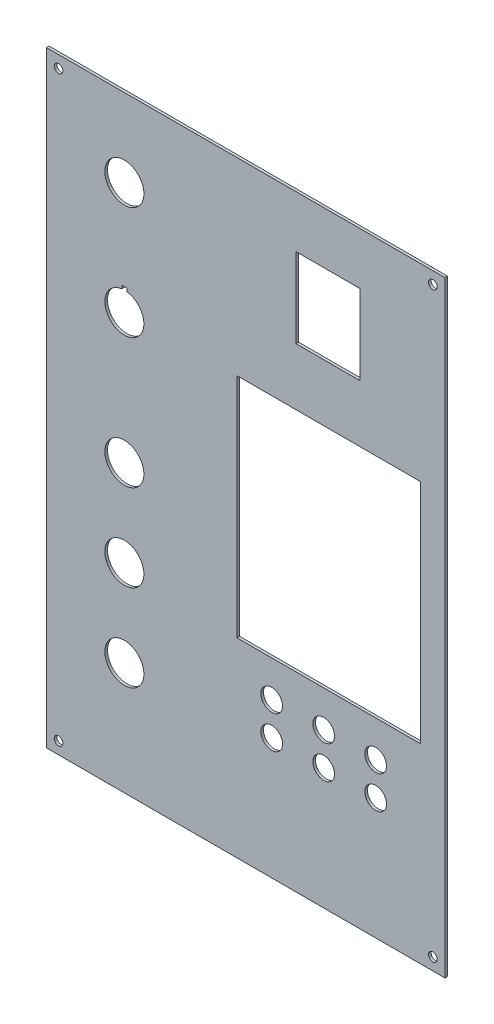
ISO-10303-21;
HEADER;
FILE_DESCRIPTION(('STEP AP214'),'2;1');
FILE_NAME('part.step','',(''),(''),'','','');
FILE_SCHEMA(('AUTOMOTIVE_DESIGN { 1 0 10303 214 1 1 1 1 }'));
ENDSEC;
DATA;
#1=APPLICATION_CONTEXT('core data for automotive mechanical design processes');
#2=APPLICATION_PROTOCOL_DEFINITION('international standard','automotive_design',2000,#1);
#3=PRODUCT_CONTEXT('',#1,'mechanical');
#4=PRODUCT('Part','Part','',(#3));
#5=PRODUCT_RELATED_PRODUCT_CATEGORY('part','',(#4));
#6=PRODUCT_DEFINITION_FORMATION('','',#4);
#7=PRODUCT_DEFINITION_CONTEXT('part definition',#1,'design');
#8=PRODUCT_DEFINITION('design','',#6,#7);
#9=PRODUCT_DEFINITION_SHAPE('','',#8);
#10=(LENGTH_UNIT() NAMED_UNIT(*) SI_UNIT(.MILLI.,.METRE.));
#11=(NAMED_UNIT(*) PLANE_ANGLE_UNIT() SI_UNIT($,.RADIAN.));
#12=(NAMED_UNIT(*) SI_UNIT($,.STERADIAN.) SOLID_ANGLE_UNIT());
#13=UNCERTAINTY_MEASURE_WITH_UNIT(LENGTH_MEASURE(1.E-05),#10,'distance_accuracy_value','');
#14=(GEOMETRIC_REPRESENTATION_CONTEXT(3) GLOBAL_UNCERTAINTY_ASSIGNED_CONTEXT((#13)) GLOBAL_UNIT_ASSIGNED_CONTEXT((#10,
#11,#12)) REPRESENTATION_CONTEXT('',''));
#15=CARTESIAN_POINT('',(0.,0.,0.));
#16=DIRECTION('',(0.,0.,1.));
#17=DIRECTION('',(1.,0.,0.));
#18=AXIS2_PLACEMENT_3D('',#15,#16,#17);
#19=CARTESIAN_POINT('',(0.,0.,1.5));
#20=DIRECTION('',(1.,0.,0.));
#21=DIRECTION('',(0.,0.,-1.));
#22=AXIS2_PLACEMENT_3D('',#19,#20,#21);
#23=PLANE('',#22);
#24=DIRECTION('',(0.,-1.,0.));
#25=VECTOR('',#24,1.);
#26=CARTESIAN_POINT('',(0.,0.,0.));
#27=LINE('',#26,#25);
#28=CARTESIAN_POINT('',(0.,350.,0.));
#29=VERTEX_POINT('',#28);
#30=CARTESIAN_POINT('',(0.,0.,0.));
#31=VERTEX_POINT('',#30);
#32=EDGE_CURVE('E329',#29,#31,#27,.T.);
#33=ORIENTED_EDGE('',*,*,#32,.T.);
#34=DIRECTION('',(0.,0.,-1.));
#35=VECTOR('',#34,1.);
#36=CARTESIAN_POINT('',(0.,0.,1.5));
#37=LINE('',#36,#35);
#38=CARTESIAN_POINT('',(0.,0.,1.5));
#39=VERTEX_POINT('',#38);
#40=EDGE_CURVE('E11',#39,#31,#37,.T.);
#41=ORIENTED_EDGE('',*,*,#40,.F.);
#42=DIRECTION('',(0.,-1.,0.));
#43=VECTOR('',#42,1.);
#44=CARTESIAN_POINT('',(0.,0.,1.5));
#45=LINE('',#44,#43);
#46=CARTESIAN_POINT('',(0.,350.,1.5));
#47=VERTEX_POINT('',#46);
#48=EDGE_CURVE('E338',#47,#39,#45,.T.);
#49=ORIENTED_EDGE('',*,*,#48,.F.);
#50=DIRECTION('',(0.,0.,-1.));
#51=VECTOR('',#50,1.);
#52=CARTESIAN_POINT('',(0.,350.,1.5));
#53=LINE('',#52,#51);
#54=EDGE_CURVE('E347',#47,#29,#53,.T.);
#55=ORIENTED_EDGE('',*,*,#54,.T.);
#56=EDGE_LOOP('',(#33,#41,#49,#55));
#57=FACE_BOUND('',#56,.T.);
#58=ADVANCED_FACE('F33',(#57),#23,.F.);
#59=CARTESIAN_POINT('',(0.,0.,1.5));
#60=DIRECTION('',(0.,1.,0.));
#61=DIRECTION('',(0.,0.,1.));
#62=AXIS2_PLACEMENT_3D('',#59,#60,#61);
#63=PLANE('',#62);
#64=DIRECTION('',(1.,0.,0.));
#65=VECTOR('',#64,1.);
#66=CARTESIAN_POINT('',(0.,0.,0.));
#67=LINE('',#66,#65);
#68=CARTESIAN_POINT('',(230.,0.,0.));
#69=VERTEX_POINT('',#68);
#70=EDGE_CURVE('E332',#31,#69,#67,.T.);
#71=ORIENTED_EDGE('',*,*,#70,.T.);
#72=DIRECTION('',(0.,0.,-1.));
#73=VECTOR('',#72,1.);
#74=CARTESIAN_POINT('',(230.,0.,1.5));
#75=LINE('',#74,#73);
#76=CARTESIAN_POINT('',(230.,0.,1.5));
#77=VERTEX_POINT('',#76);
#78=EDGE_CURVE('E40',#77,#69,#75,.T.);
#79=ORIENTED_EDGE('',*,*,#78,.F.);
#80=DIRECTION('',(1.,0.,0.));
#81=VECTOR('',#80,1.);
#82=CARTESIAN_POINT('',(0.,0.,1.5));
#83=LINE('',#82,#81);
#84=EDGE_CURVE('E341',#39,#77,#83,.T.);
#85=ORIENTED_EDGE('',*,*,#84,.F.);
#86=ORIENTED_EDGE('',*,*,#40,.T.);
#87=EDGE_LOOP('',(#71,#79,#85,#86));
#88=FACE_BOUND('',#87,.T.);
#89=ADVANCED_FACE('F372',(#88),#63,.F.);
#90=CARTESIAN_POINT('',(230.,0.,1.5));
#91=DIRECTION('',(-1.,0.,0.));
#92=DIRECTION('',(0.,0.,1.));
#93=AXIS2_PLACEMENT_3D('',#90,#91,#92);
#94=PLANE('',#93);
#95=DIRECTION('',(0.,1.,0.));
#96=VECTOR('',#95,1.);
#97=CARTESIAN_POINT('',(230.,0.,0.));
#98=LINE('',#97,#96);
#99=CARTESIAN_POINT('',(230.,350.,0.));
#100=VERTEX_POINT('',#99);
#101=EDGE_CURVE('E334',#69,#100,#98,.T.);
#102=ORIENTED_EDGE('',*,*,#101,.T.);
#103=DIRECTION('',(0.,0.,-1.));
#104=VECTOR('',#103,1.);
#105=CARTESIAN_POINT('',(230.,350.,1.5));
#106=LINE('',#105,#104);
#107=CARTESIAN_POINT('',(230.,350.,1.5));
#108=VERTEX_POINT('',#107);
#109=EDGE_CURVE('E350',#108,#100,#106,.T.);
#110=ORIENTED_EDGE('',*,*,#109,.F.);
#111=DIRECTION('',(0.,1.,0.));
#112=VECTOR('',#111,1.);
#113=CARTESIAN_POINT('',(230.,0.,1.5));
#114=LINE('',#113,#112);
#115=EDGE_CURVE('E343',#77,#108,#114,.T.);
#116=ORIENTED_EDGE('',*,*,#115,.F.);
#117=ORIENTED_EDGE('',*,*,#78,.T.);
#118=EDGE_LOOP('',(#102,#110,#116,#117));
#119=FACE_BOUND('',#118,.T.);
#120=ADVANCED_FACE('F357',(#119),#94,.F.);
#121=CARTESIAN_POINT('',(0.,350.,1.5));
#122=DIRECTION('',(0.,-1.,0.));
#123=DIRECTION('',(0.,0.,-1.));
#124=AXIS2_PLACEMENT_3D('',#121,#122,#123);
#125=PLANE('',#124);
#126=DIRECTION('',(-1.,0.,0.));
#127=VECTOR('',#126,1.);
#128=CARTESIAN_POINT('',(0.,350.,0.));
#129=LINE('',#128,#127);
#130=EDGE_CURVE('E336',#100,#29,#129,.T.);
#131=ORIENTED_EDGE('',*,*,#130,.T.);
#132=ORIENTED_EDGE('',*,*,#54,.F.);
#133=DIRECTION('',(-1.,0.,0.));
#134=VECTOR('',#133,1.);
#135=CARTESIAN_POINT('',(0.,350.,1.5));
#136=LINE('',#135,#134);
#137=EDGE_CURVE('E345',#108,#47,#136,.T.);
#138=ORIENTED_EDGE('',*,*,#137,.F.);
#139=ORIENTED_EDGE('',*,*,#109,.T.);
#140=EDGE_LOOP('',(#131,#132,#138,#139));
#141=FACE_BOUND('',#140,.T.);
#142=ADVANCED_FACE('F366',(#141),#125,.F.);
#143=CARTESIAN_POINT('',(0.,350.,1.5));
#144=DIRECTION('',(0.,0.,-1.));
#145=DIRECTION('',(-1.,0.,0.));
#146=AXIS2_PLACEMENT_3D('',#143,#144,#145);
#147=PLANE('',#146);
#148=DIRECTION('',(1.,0.,0.));
#149=VECTOR('',#148,1.);
#150=CARTESIAN_POINT('',(144.,274.,1.5));
#151=LINE('',#150,#149);
#152=CARTESIAN_POINT('',(144.,274.,1.5));
#153=VERTEX_POINT('',#152);
#154=CARTESIAN_POINT('',(181.,274.,1.5));
#155=VERTEX_POINT('',#154);
#156=EDGE_CURVE('E156',#153,#155,#151,.T.);
#157=ORIENTED_EDGE('',*,*,#156,.F.);
#158=DIRECTION('',(0.,-1.,0.));
#159=VECTOR('',#158,1.);
#160=CARTESIAN_POINT('',(144.,320.,1.5));
#161=LINE('',#160,#159);
#162=CARTESIAN_POINT('',(144.,320.,1.5));
#163=VERTEX_POINT('',#162);
#164=EDGE_CURVE('E47',#163,#153,#161,.T.);
#165=ORIENTED_EDGE('',*,*,#164,.F.);
#166=DIRECTION('',(-1.,0.,0.));
#167=VECTOR('',#166,1.);
#168=CARTESIAN_POINT('',(144.,320.,1.5));
#169=LINE('',#168,#167);
#170=CARTESIAN_POINT('',(181.,320.,1.5));
#171=VERTEX_POINT('',#170);
#172=EDGE_CURVE('E163',#171,#163,#169,.T.);
#173=ORIENTED_EDGE('',*,*,#172,.F.);
#174=DIRECTION('',(0.,1.,0.));
#175=VECTOR('',#174,1.);
#176=CARTESIAN_POINT('',(181.,320.,1.5));
#177=LINE('',#176,#175);
#178=EDGE_CURVE('E147',#155,#171,#177,.T.);
#179=ORIENTED_EDGE('',*,*,#178,.F.);
#180=EDGE_LOOP('',(#157,#165,#173,#179));
#181=FACE_BOUND('',#180,.T.);
#182=DIRECTION('',(1.,0.,0.));
#183=VECTOR('',#182,1.);
#184=CARTESIAN_POINT('',(110.,110.,1.5));
#185=LINE('',#184,#183);
#186=CARTESIAN_POINT('',(110.,110.,1.5));
#187=VERTEX_POINT('',#186);
#188=CARTESIAN_POINT('',(216.,110.,1.5));
#189=VERTEX_POINT('',#188);
#190=EDGE_CURVE('E183',#187,#189,#185,.T.);
#191=ORIENTED_EDGE('',*,*,#190,.F.);
#192=DIRECTION('',(0.,-1.,0.));
#193=VECTOR('',#192,1.);
#194=CARTESIAN_POINT('',(110.,241.,1.5));
#195=LINE('',#194,#193);
#196=CARTESIAN_POINT('',(110.,241.,1.5));
#197=VERTEX_POINT('',#196);
#198=EDGE_CURVE('E179',#197,#187,#195,.T.);
#199=ORIENTED_EDGE('',*,*,#198,.F.);
#200=DIRECTION('',(-1.,0.,0.));
#201=VECTOR('',#200,1.);
#202=CARTESIAN_POINT('',(110.,241.,1.5));
#203=LINE('',#202,#201);
#204=CARTESIAN_POINT('',(216.,241.,1.5));
#205=VERTEX_POINT('',#204);
#206=EDGE_CURVE('E189',#205,#197,#203,.T.);
#207=ORIENTED_EDGE('',*,*,#206,.F.);
#208=DIRECTION('',(0.,1.,0.));
#209=VECTOR('',#208,1.);
#210=CARTESIAN_POINT('',(216.,241.,1.5));
#211=LINE('',#210,#209);
#212=EDGE_CURVE('E186',#189,#205,#211,.T.);
#213=ORIENTED_EDGE('',*,*,#212,.F.);
#214=EDGE_LOOP('',(#191,#199,#207,#213));
#215=FACE_BOUND('',#214,.T.);
#216=CARTESIAN_POINT('',(190.,89.,1.5));
#217=DIRECTION('',(0.,0.,1.));
#218=DIRECTION('',(1.,0.,0.));
#219=AXIS2_PLACEMENT_3D('',#216,#217,#218);
#220=CIRCLE('',#219,6.25);
#221=CARTESIAN_POINT('',(196.25,89.,1.5));
#222=VERTEX_POINT('',#221);
#223=EDGE_CURVE('E207',#222,#222,#220,.T.);
#224=ORIENTED_EDGE('',*,*,#223,.F.);
#225=EDGE_LOOP('',(#224));
#226=FACE_BOUND('',#225,.T.);
#227=CARTESIAN_POINT('',(190.,70.,1.5));
#228=DIRECTION('',(0.,0.,1.));
#229=DIRECTION('',(1.,0.,0.));
#230=AXIS2_PLACEMENT_3D('',#227,#228,#229);
#231=CIRCLE('',#230,6.25);
#232=CARTESIAN_POINT('',(196.25,70.,1.5));
#233=VERTEX_POINT('',#232);
#234=EDGE_CURVE('E219',#233,#233,#231,.T.);
#235=ORIENTED_EDGE('',*,*,#234,.F.);
#236=EDGE_LOOP('',(#235));
#237=FACE_BOUND('',#236,.T.);
#238=CARTESIAN_POINT('',(160.,89.,1.5));
#239=DIRECTION('',(0.,0.,1.));
#240=DIRECTION('',(1.,0.,0.));
#241=AXIS2_PLACEMENT_3D('',#238,#239,#240);
#242=CIRCLE('',#241,6.25);
#243=CARTESIAN_POINT('',(166.25,89.,1.5));
#244=VERTEX_POINT('',#243);
#245=EDGE_CURVE('E225',#244,#244,#242,.T.);
#246=ORIENTED_EDGE('',*,*,#245,.F.);
#247=EDGE_LOOP('',(#246));
#248=FACE_BOUND('',#247,.T.);
#249=CARTESIAN_POINT('',(160.,70.,1.5));
#250=DIRECTION('',(0.,0.,1.));
#251=DIRECTION('',(1.,0.,0.));
#252=AXIS2_PLACEMENT_3D('',#249,#250,#251);
#253=CIRCLE('',#252,6.25);
#254=CARTESIAN_POINT('',(166.25,70.,1.5));
#255=VERTEX_POINT('',#254);
#256=EDGE_CURVE('E231',#255,#255,#253,.T.);
#257=ORIENTED_EDGE('',*,*,#256,.F.);
#258=EDGE_LOOP('',(#257));
#259=FACE_BOUND('',#258,.T.);
#260=CARTESIAN_POINT('',(130.,89.,1.5));
#261=DIRECTION('',(0.,0.,1.));
#262=DIRECTION('',(1.,0.,0.));
#263=AXIS2_PLACEMENT_3D('',#260,#261,#262);
#264=CIRCLE('',#263,6.25);
#265=CARTESIAN_POINT('',(136.25,89.,1.5));
#266=VERTEX_POINT('',#265);
#267=EDGE_CURVE('E237',#266,#266,#264,.T.);
#268=ORIENTED_EDGE('',*,*,#267,.F.);
#269=EDGE_LOOP('',(#268));
#270=FACE_BOUND('',#269,.T.);
#271=CARTESIAN_POINT('',(130.,70.,1.5));
#272=DIRECTION('',(0.,0.,1.));
#273=DIRECTION('',(1.,0.,0.));
#274=AXIS2_PLACEMENT_3D('',#271,#272,#273);
#275=CIRCLE('',#274,6.25);
#276=CARTESIAN_POINT('',(136.25,70.,1.5));
#277=VERTEX_POINT('',#276);
#278=EDGE_CURVE('E243',#277,#277,#275,.T.);
#279=ORIENTED_EDGE('',*,*,#278,.F.);
#280=EDGE_LOOP('',(#279));
#281=FACE_BOUND('',#280,.T.);
#282=DIRECTION('',(0.,1.,0.));
#283=VECTOR('',#282,1.);
#284=CARTESIAN_POINT('',(46.5,251.149551560489,1.5));
#285=LINE('',#284,#283);
#286=CARTESIAN_POINT('',(46.5,251.149551560489,1.5));
#287=VERTEX_POINT('',#286);
#288=CARTESIAN_POINT('',(46.5,253.,1.5));
#289=VERTEX_POINT('',#288);
#290=EDGE_CURVE('E251',#287,#289,#285,.T.);
#291=ORIENTED_EDGE('',*,*,#290,.F.);
#292=CARTESIAN_POINT('',(45.,240.,1.5));
#293=DIRECTION('',(0.,0.,1.));
#294=DIRECTION('',(1.,0.,0.));
#295=AXIS2_PLACEMENT_3D('',#292,#293,#294);
#296=CIRCLE('',#295,11.25);
#297=CARTESIAN_POINT('',(43.5,251.149551560489,1.5));
#298=VERTEX_POINT('',#297);
#299=EDGE_CURVE('E249',#298,#287,#296,.T.);
#300=ORIENTED_EDGE('',*,*,#299,.F.);
#301=DIRECTION('',(0.,-1.,0.));
#302=VECTOR('',#301,1.);
#303=CARTESIAN_POINT('',(43.5,251.149551560489,1.5));
#304=LINE('',#303,#302);
#305=CARTESIAN_POINT('',(43.5,253.,1.5));
#306=VERTEX_POINT('',#305);
#307=EDGE_CURVE('E257',#306,#298,#304,.T.);
#308=ORIENTED_EDGE('',*,*,#307,.F.);
#309=DIRECTION('',(-1.,0.,0.));
#310=VECTOR('',#309,1.);
#311=CARTESIAN_POINT('',(43.5,253.,1.5));
#312=LINE('',#311,#310);
#313=EDGE_CURVE('E254',#289,#306,#312,.T.);
#314=ORIENTED_EDGE('',*,*,#313,.F.);
#315=EDGE_LOOP('',(#291,#300,#308,#314));
#316=FACE_BOUND('',#315,.T.);
#317=CARTESIAN_POINT('',(45.,165.,1.5));
#318=DIRECTION('',(0.,0.,1.));
#319=DIRECTION('',(1.,0.,0.));
#320=AXIS2_PLACEMENT_3D('',#317,#318,#319);
#321=CIRCLE('',#320,11.25);
#322=CARTESIAN_POINT('',(56.25,165.,1.5));
#323=VERTEX_POINT('',#322);
#324=EDGE_CURVE('E275',#323,#323,#321,.T.);
#325=ORIENTED_EDGE('',*,*,#324,.F.);
#326=EDGE_LOOP('',(#325));
#327=FACE_BOUND('',#326,.T.);
#328=CARTESIAN_POINT('',(45.,305.,1.5));
#329=DIRECTION('',(0.,0.,1.));
#330=DIRECTION('',(1.,0.,0.));
#331=AXIS2_PLACEMENT_3D('',#328,#329,#330);
#332=CIRCLE('',#331,11.25);
#333=CARTESIAN_POINT('',(56.25,305.,1.5));
#334=VERTEX_POINT('',#333);
#335=EDGE_CURVE('E287',#334,#334,#332,.T.);
#336=ORIENTED_EDGE('',*,*,#335,.F.);
#337=EDGE_LOOP('',(#336));
#338=FACE_BOUND('',#337,.T.);
#339=CARTESIAN_POINT('',(45.,115.,1.5));
#340=DIRECTION('',(0.,0.,1.));
#341=DIRECTION('',(1.,0.,0.));
#342=AXIS2_PLACEMENT_3D('',#339,#340,#341);
#343=CIRCLE('',#342,11.25);
#344=CARTESIAN_POINT('',(56.25,115.,1.5));
#345=VERTEX_POINT('',#344);
#346=EDGE_CURVE('E293',#345,#345,#343,.T.);
#347=ORIENTED_EDGE('',*,*,#346,.F.);
#348=EDGE_LOOP('',(#347));
#349=FACE_BOUND('',#348,.T.);
#350=CARTESIAN_POINT('',(45.,65.,1.5));
#351=DIRECTION('',(0.,0.,1.));
#352=DIRECTION('',(1.,0.,0.));
#353=AXIS2_PLACEMENT_3D('',#350,#351,#352);
#354=CIRCLE('',#353,11.25);
#355=CARTESIAN_POINT('',(56.25,65.,1.5));
#356=VERTEX_POINT('',#355);
#357=EDGE_CURVE('E299',#356,#356,#354,.T.);
#358=ORIENTED_EDGE('',*,*,#357,.F.);
#359=EDGE_LOOP('',(#358));
#360=FACE_BOUND('',#359,.T.);
#361=CARTESIAN_POINT('',(223.,343.,1.5));
#362=DIRECTION('',(0.,0.,1.));
#363=DIRECTION('',(1.,0.,0.));
#364=AXIS2_PLACEMENT_3D('',#361,#362,#363);
#365=CIRCLE('',#364,2.5);
#366=CARTESIAN_POINT('',(225.5,343.,1.5));
#367=VERTEX_POINT('',#366);
#368=EDGE_CURVE('E305',#367,#367,#365,.T.);
#369=ORIENTED_EDGE('',*,*,#368,.F.);
#370=EDGE_LOOP('',(#369));
#371=FACE_BOUND('',#370,.T.);
#372=CARTESIAN_POINT('',(7.,343.,1.5));
#373=DIRECTION('',(0.,0.,1.));
#374=DIRECTION('',(1.,0.,0.));
#375=AXIS2_PLACEMENT_3D('',#372,#373,#374);
#376=CIRCLE('',#375,2.50000000000001);
#377=CARTESIAN_POINT('',(9.50000000000001,343.,1.5));
#378=VERTEX_POINT('',#377);
#379=EDGE_CURVE('E311',#378,#378,#376,.T.);
#380=ORIENTED_EDGE('',*,*,#379,.F.);
#381=EDGE_LOOP('',(#380));
#382=FACE_BOUND('',#381,.T.);
#383=CARTESIAN_POINT('',(223.,7.00000000000001,1.5));
#384=DIRECTION('',(0.,0.,1.));
#385=DIRECTION('',(1.,0.,0.));
#386=AXIS2_PLACEMENT_3D('',#383,#384,#385);
#387=CIRCLE('',#386,2.5);
#388=CARTESIAN_POINT('',(225.5,7.00000000000001,1.5));
#389=VERTEX_POINT('',#388);
#390=EDGE_CURVE('E317',#389,#389,#387,.T.);
#391=ORIENTED_EDGE('',*,*,#390,.F.);
#392=EDGE_LOOP('',(#391));
#393=FACE_BOUND('',#392,.T.);
#394=CARTESIAN_POINT('',(7.,7.00000000000001,1.5));
#395=DIRECTION('',(0.,0.,1.));
#396=DIRECTION('',(1.,0.,0.));
#397=AXIS2_PLACEMENT_3D('',#394,#395,#396);
#398=CIRCLE('',#397,2.50000000000001);
#399=CARTESIAN_POINT('',(9.50000000000001,7.00000000000001,1.5));
#400=VERTEX_POINT('',#399);
#401=EDGE_CURVE('E323',#400,#400,#398,.T.);
#402=ORIENTED_EDGE('',*,*,#401,.F.);
#403=EDGE_LOOP('',(#402));
#404=FACE_BOUND('',#403,.T.);
#405=ORIENTED_EDGE('',*,*,#48,.T.);
#406=ORIENTED_EDGE('',*,*,#84,.T.);
#407=ORIENTED_EDGE('',*,*,#115,.T.);
#408=ORIENTED_EDGE('',*,*,#137,.T.);
#409=EDGE_LOOP('',(#405,#406,#407,#408));
#410=FACE_BOUND('',#409,.T.);
#411=ADVANCED_FACE('F160',(#181,#215,#226,#237,#248,#259,#270,#281,#316,#327,#338,#349,#360,
#371,#382,#393,#404,#410),#147,.F.);
#412=CARTESIAN_POINT('',(0.,350.,0.));
#413=DIRECTION('',(0.,0.,-1.));
#414=DIRECTION('',(-1.,0.,0.));
#415=AXIS2_PLACEMENT_3D('',#412,#413,#414);
#416=PLANE('',#415);
#417=DIRECTION('',(0.,-1.,0.));
#418=VECTOR('',#417,1.);
#419=CARTESIAN_POINT('',(144.,320.,0.));
#420=LINE('',#419,#418);
#421=CARTESIAN_POINT('',(144.,320.,0.));
#422=VERTEX_POINT('',#421);
#423=CARTESIAN_POINT('',(144.,274.,0.));
#424=VERTEX_POINT('',#423);
#425=EDGE_CURVE('E165',#422,#424,#420,.T.);
#426=ORIENTED_EDGE('',*,*,#425,.T.);
#427=DIRECTION('',(1.,0.,0.));
#428=VECTOR('',#427,1.);
#429=CARTESIAN_POINT('',(144.,274.,0.));
#430=LINE('',#429,#428);
#431=CARTESIAN_POINT('',(181.,274.,0.));
#432=VERTEX_POINT('',#431);
#433=EDGE_CURVE('E171',#424,#432,#430,.T.);
#434=ORIENTED_EDGE('',*,*,#433,.T.);
#435=DIRECTION('',(0.,1.,0.));
#436=VECTOR('',#435,1.);
#437=CARTESIAN_POINT('',(181.,320.,0.));
#438=LINE('',#437,#436);
#439=CARTESIAN_POINT('',(181.,320.,0.));
#440=VERTEX_POINT('',#439);
#441=EDGE_CURVE('E55',#432,#440,#438,.T.);
#442=ORIENTED_EDGE('',*,*,#441,.T.);
#443=DIRECTION('',(-1.,0.,0.));
#444=VECTOR('',#443,1.);
#445=CARTESIAN_POINT('',(144.,320.,0.));
#446=LINE('',#445,#444);
#447=EDGE_CURVE('E174',#440,#422,#446,.T.);
#448=ORIENTED_EDGE('',*,*,#447,.T.);
#449=EDGE_LOOP('',(#426,#434,#442,#448));
#450=FACE_BOUND('',#449,.T.);
#451=DIRECTION('',(0.,-1.,0.));
#452=VECTOR('',#451,1.);
#453=CARTESIAN_POINT('',(110.,241.,0.));
#454=LINE('',#453,#452);
#455=CARTESIAN_POINT('',(110.,241.,0.));
#456=VERTEX_POINT('',#455);
#457=CARTESIAN_POINT('',(110.,110.,0.));
#458=VERTEX_POINT('',#457);
#459=EDGE_CURVE('E192',#456,#458,#454,.T.);
#460=ORIENTED_EDGE('',*,*,#459,.T.);
#461=DIRECTION('',(1.,0.,0.));
#462=VECTOR('',#461,1.);
#463=CARTESIAN_POINT('',(110.,110.,0.));
#464=LINE('',#463,#462);
#465=CARTESIAN_POINT('',(216.,110.,0.));
#466=VERTEX_POINT('',#465);
#467=EDGE_CURVE('E195',#458,#466,#464,.T.);
#468=ORIENTED_EDGE('',*,*,#467,.T.);
#469=DIRECTION('',(0.,1.,0.));
#470=VECTOR('',#469,1.);
#471=CARTESIAN_POINT('',(216.,241.,0.));
#472=LINE('',#471,#470);
#473=CARTESIAN_POINT('',(216.,241.,0.));
#474=VERTEX_POINT('',#473);
#475=EDGE_CURVE('E198',#466,#474,#472,.T.);
#476=ORIENTED_EDGE('',*,*,#475,.T.);
#477=DIRECTION('',(-1.,0.,0.));
#478=VECTOR('',#477,1.);
#479=CARTESIAN_POINT('',(110.,241.,0.));
#480=LINE('',#479,#478);
#481=EDGE_CURVE('E201',#474,#456,#480,.T.);
#482=ORIENTED_EDGE('',*,*,#481,.T.);
#483=EDGE_LOOP('',(#460,#468,#476,#482));
#484=FACE_BOUND('',#483,.T.);
#485=CARTESIAN_POINT('',(190.,89.,0.));
#486=DIRECTION('',(0.,0.,1.));
#487=DIRECTION('',(1.,0.,0.));
#488=AXIS2_PLACEMENT_3D('',#485,#486,#487);
#489=CIRCLE('',#488,6.25);
#490=CARTESIAN_POINT('',(196.25,89.,0.));
#491=VERTEX_POINT('',#490);
#492=EDGE_CURVE('E216',#491,#491,#489,.T.);
#493=ORIENTED_EDGE('',*,*,#492,.T.);
#494=EDGE_LOOP('',(#493));
#495=FACE_BOUND('',#494,.T.);
#496=CARTESIAN_POINT('',(190.,70.,0.));
#497=DIRECTION('',(0.,0.,1.));
#498=DIRECTION('',(1.,0.,0.));
#499=AXIS2_PLACEMENT_3D('',#496,#497,#498);
#500=CIRCLE('',#499,6.25);
#501=CARTESIAN_POINT('',(196.25,70.,0.));
#502=VERTEX_POINT('',#501);
#503=EDGE_CURVE('E222',#502,#502,#500,.T.);
#504=ORIENTED_EDGE('',*,*,#503,.T.);
#505=EDGE_LOOP('',(#504));
#506=FACE_BOUND('',#505,.T.);
#507=CARTESIAN_POINT('',(160.,89.,0.));
#508=DIRECTION('',(0.,0.,1.));
#509=DIRECTION('',(1.,0.,0.));
#510=AXIS2_PLACEMENT_3D('',#507,#508,#509);
#511=CIRCLE('',#510,6.25);
#512=CARTESIAN_POINT('',(166.25,89.,0.));
#513=VERTEX_POINT('',#512);
#514=EDGE_CURVE('E228',#513,#513,#511,.T.);
#515=ORIENTED_EDGE('',*,*,#514,.T.);
#516=EDGE_LOOP('',(#515));
#517=FACE_BOUND('',#516,.T.);
#518=CARTESIAN_POINT('',(160.,70.,0.));
#519=DIRECTION('',(0.,0.,1.));
#520=DIRECTION('',(1.,0.,0.));
#521=AXIS2_PLACEMENT_3D('',#518,#519,#520);
#522=CIRCLE('',#521,6.25);
#523=CARTESIAN_POINT('',(166.25,70.,0.));
#524=VERTEX_POINT('',#523);
#525=EDGE_CURVE('E234',#524,#524,#522,.T.);
#526=ORIENTED_EDGE('',*,*,#525,.T.);
#527=EDGE_LOOP('',(#526));
#528=FACE_BOUND('',#527,.T.);
#529=CARTESIAN_POINT('',(130.,89.,0.));
#530=DIRECTION('',(0.,0.,1.));
#531=DIRECTION('',(1.,0.,0.));
#532=AXIS2_PLACEMENT_3D('',#529,#530,#531);
#533=CIRCLE('',#532,6.25);
#534=CARTESIAN_POINT('',(136.25,89.,0.));
#535=VERTEX_POINT('',#534);
#536=EDGE_CURVE('E240',#535,#535,#533,.T.);
#537=ORIENTED_EDGE('',*,*,#536,.T.);
#538=EDGE_LOOP('',(#537));
#539=FACE_BOUND('',#538,.T.);
#540=CARTESIAN_POINT('',(130.,70.,0.));
#541=DIRECTION('',(0.,0.,1.));
#542=DIRECTION('',(1.,0.,0.));
#543=AXIS2_PLACEMENT_3D('',#540,#541,#542);
#544=CIRCLE('',#543,6.25);
#545=CARTESIAN_POINT('',(136.25,70.,0.));
#546=VERTEX_POINT('',#545);
#547=EDGE_CURVE('E246',#546,#546,#544,.T.);
#548=ORIENTED_EDGE('',*,*,#547,.T.);
#549=EDGE_LOOP('',(#548));
#550=FACE_BOUND('',#549,.T.);
#551=CARTESIAN_POINT('',(45.,240.,0.));
#552=DIRECTION('',(0.,0.,1.));
#553=DIRECTION('',(1.,0.,0.));
#554=AXIS2_PLACEMENT_3D('',#551,#552,#553);
#555=CIRCLE('',#554,11.25);
#556=CARTESIAN_POINT('',(43.5,251.149551560489,0.));
#557=VERTEX_POINT('',#556);
#558=CARTESIAN_POINT('',(46.5,251.149551560489,0.));
#559=VERTEX_POINT('',#558);
#560=EDGE_CURVE('E260',#557,#559,#555,.T.);
#561=ORIENTED_EDGE('',*,*,#560,.T.);
#562=DIRECTION('',(0.,1.,0.));
#563=VECTOR('',#562,1.);
#564=CARTESIAN_POINT('',(46.5,251.149551560489,0.));
#565=LINE('',#564,#563);
#566=CARTESIAN_POINT('',(46.5,253.,0.));
#567=VERTEX_POINT('',#566);
#568=EDGE_CURVE('E263',#559,#567,#565,.T.);
#569=ORIENTED_EDGE('',*,*,#568,.T.);
#570=DIRECTION('',(-1.,0.,0.));
#571=VECTOR('',#570,1.);
#572=CARTESIAN_POINT('',(43.5,253.,0.));
#573=LINE('',#572,#571);
#574=CARTESIAN_POINT('',(43.5,253.,0.));
#575=VERTEX_POINT('',#574);
#576=EDGE_CURVE('E266',#567,#575,#573,.T.);
#577=ORIENTED_EDGE('',*,*,#576,.T.);
#578=DIRECTION('',(0.,-1.,0.));
#579=VECTOR('',#578,1.);
#580=CARTESIAN_POINT('',(43.5,251.149551560489,0.));
#581=LINE('',#580,#579);
#582=EDGE_CURVE('E269',#575,#557,#581,.T.);
#583=ORIENTED_EDGE('',*,*,#582,.T.);
#584=EDGE_LOOP('',(#561,#569,#577,#583));
#585=FACE_BOUND('',#584,.T.);
#586=CARTESIAN_POINT('',(45.,165.,0.));
#587=DIRECTION('',(0.,0.,1.));
#588=DIRECTION('',(1.,0.,0.));
#589=AXIS2_PLACEMENT_3D('',#586,#587,#588);
#590=CIRCLE('',#589,11.25);
#591=CARTESIAN_POINT('',(56.25,165.,0.));
#592=VERTEX_POINT('',#591);
#593=EDGE_CURVE('E284',#592,#592,#590,.T.);
#594=ORIENTED_EDGE('',*,*,#593,.T.);
#595=EDGE_LOOP('',(#594));
#596=FACE_BOUND('',#595,.T.);
#597=CARTESIAN_POINT('',(45.,305.,0.));
#598=DIRECTION('',(0.,0.,1.));
#599=DIRECTION('',(1.,0.,0.));
#600=AXIS2_PLACEMENT_3D('',#597,#598,#599);
#601=CIRCLE('',#600,11.25);
#602=CARTESIAN_POINT('',(56.25,305.,0.));
#603=VERTEX_POINT('',#602);
#604=EDGE_CURVE('E290',#603,#603,#601,.T.);
#605=ORIENTED_EDGE('',*,*,#604,.T.);
#606=EDGE_LOOP('',(#605));
#607=FACE_BOUND('',#606,.T.);
#608=CARTESIAN_POINT('',(45.,115.,0.));
#609=DIRECTION('',(0.,0.,1.));
#610=DIRECTION('',(1.,0.,0.));
#611=AXIS2_PLACEMENT_3D('',#608,#609,#610);
#612=CIRCLE('',#611,11.25);
#613=CARTESIAN_POINT('',(56.25,115.,0.));
#614=VERTEX_POINT('',#613);
#615=EDGE_CURVE('E296',#614,#614,#612,.T.);
#616=ORIENTED_EDGE('',*,*,#615,.T.);
#617=EDGE_LOOP('',(#616));
#618=FACE_BOUND('',#617,.T.);
#619=CARTESIAN_POINT('',(45.,65.,0.));
#620=DIRECTION('',(0.,0.,1.));
#621=DIRECTION('',(1.,0.,0.));
#622=AXIS2_PLACEMENT_3D('',#619,#620,#621);
#623=CIRCLE('',#622,11.25);
#624=CARTESIAN_POINT('',(56.25,65.,0.));
#625=VERTEX_POINT('',#624);
#626=EDGE_CURVE('E302',#625,#625,#623,.T.);
#627=ORIENTED_EDGE('',*,*,#626,.T.);
#628=EDGE_LOOP('',(#627));
#629=FACE_BOUND('',#628,.T.);
#630=CARTESIAN_POINT('',(223.,343.,0.));
#631=DIRECTION('',(0.,0.,1.));
#632=DIRECTION('',(1.,0.,0.));
#633=AXIS2_PLACEMENT_3D('',#630,#631,#632);
#634=CIRCLE('',#633,2.5);
#635=CARTESIAN_POINT('',(225.5,343.,0.));
#636=VERTEX_POINT('',#635);
#637=EDGE_CURVE('E308',#636,#636,#634,.T.);
#638=ORIENTED_EDGE('',*,*,#637,.T.);
#639=EDGE_LOOP('',(#638));
#640=FACE_BOUND('',#639,.T.);
#641=CARTESIAN_POINT('',(7.,343.,0.));
#642=DIRECTION('',(0.,0.,1.));
#643=DIRECTION('',(1.,0.,0.));
#644=AXIS2_PLACEMENT_3D('',#641,#642,#643);
#645=CIRCLE('',#644,2.50000000000001);
#646=CARTESIAN_POINT('',(9.50000000000001,343.,0.));
#647=VERTEX_POINT('',#646);
#648=EDGE_CURVE('E314',#647,#647,#645,.T.);
#649=ORIENTED_EDGE('',*,*,#648,.T.);
#650=EDGE_LOOP('',(#649));
#651=FACE_BOUND('',#650,.T.);
#652=CARTESIAN_POINT('',(223.,7.00000000000001,0.));
#653=DIRECTION('',(0.,0.,1.));
#654=DIRECTION('',(1.,0.,0.));
#655=AXIS2_PLACEMENT_3D('',#652,#653,#654);
#656=CIRCLE('',#655,2.5);
#657=CARTESIAN_POINT('',(225.5,7.00000000000001,0.));
#658=VERTEX_POINT('',#657);
#659=EDGE_CURVE('E320',#658,#658,#656,.T.);
#660=ORIENTED_EDGE('',*,*,#659,.T.);
#661=EDGE_LOOP('',(#660));
#662=FACE_BOUND('',#661,.T.);
#663=CARTESIAN_POINT('',(7.,7.00000000000001,0.));
#664=DIRECTION('',(0.,0.,1.));
#665=DIRECTION('',(1.,0.,0.));
#666=AXIS2_PLACEMENT_3D('',#663,#664,#665);
#667=CIRCLE('',#666,2.50000000000001);
#668=CARTESIAN_POINT('',(9.50000000000001,7.00000000000001,0.));
#669=VERTEX_POINT('',#668);
#670=EDGE_CURVE('E326',#669,#669,#667,.T.);
#671=ORIENTED_EDGE('',*,*,#670,.T.);
#672=EDGE_LOOP('',(#671));
#673=FACE_BOUND('',#672,.T.);
#674=ORIENTED_EDGE('',*,*,#32,.F.);
#675=ORIENTED_EDGE('',*,*,#130,.F.);
#676=ORIENTED_EDGE('',*,*,#101,.F.);
#677=ORIENTED_EDGE('',*,*,#70,.F.);
#678=EDGE_LOOP('',(#674,#675,#676,#677));
#679=FACE_BOUND('',#678,.T.);
#680=ADVANCED_FACE('F363',(#450,#484,#495,#506,#517,#528,#539,#550,#585,#596,#607,#618,#629,
#640,#651,#662,#673,#679),#416,.T.);
#681=CARTESIAN_POINT('',(7.,7.00000000000001,0.));
#682=DIRECTION('',(0.,0.,1.));
#683=DIRECTION('',(1.,0.,0.));
#684=AXIS2_PLACEMENT_3D('',#681,#682,#683);
#685=CYLINDRICAL_SURFACE('',#684,2.50000000000001);
#686=ORIENTED_EDGE('',*,*,#670,.F.);
#687=EDGE_LOOP('',(#686));
#688=FACE_BOUND('',#687,.T.);
#689=ORIENTED_EDGE('',*,*,#401,.T.);
#690=EDGE_LOOP('',(#689));
#691=FACE_BOUND('',#690,.T.);
#692=ADVANCED_FACE('F386',(#688,#691),#685,.F.);
#693=CARTESIAN_POINT('',(223.,7.00000000000001,0.));
#694=DIRECTION('',(0.,0.,1.));
#695=DIRECTION('',(1.,0.,0.));
#696=AXIS2_PLACEMENT_3D('',#693,#694,#695);
#697=CYLINDRICAL_SURFACE('',#696,2.5);
#698=ORIENTED_EDGE('',*,*,#659,.F.);
#699=EDGE_LOOP('',(#698));
#700=FACE_BOUND('',#699,.T.);
#701=ORIENTED_EDGE('',*,*,#390,.T.);
#702=EDGE_LOOP('',(#701));
#703=FACE_BOUND('',#702,.T.);
#704=ADVANCED_FACE('F390',(#700,#703),#697,.F.);
#705=CARTESIAN_POINT('',(7.,343.,0.));
#706=DIRECTION('',(0.,0.,1.));
#707=DIRECTION('',(1.,0.,0.));
#708=AXIS2_PLACEMENT_3D('',#705,#706,#707);
#709=CYLINDRICAL_SURFACE('',#708,2.50000000000001);
#710=ORIENTED_EDGE('',*,*,#648,.F.);
#711=EDGE_LOOP('',(#710));
#712=FACE_BOUND('',#711,.T.);
#713=ORIENTED_EDGE('',*,*,#379,.T.);
#714=EDGE_LOOP('',(#713));
#715=FACE_BOUND('',#714,.T.);
#716=ADVANCED_FACE('F394',(#712,#715),#709,.F.);
#717=CARTESIAN_POINT('',(223.,343.,0.));
#718=DIRECTION('',(0.,0.,1.));
#719=DIRECTION('',(1.,0.,0.));
#720=AXIS2_PLACEMENT_3D('',#717,#718,#719);
#721=CYLINDRICAL_SURFACE('',#720,2.5);
#722=ORIENTED_EDGE('',*,*,#637,.F.);
#723=EDGE_LOOP('',(#722));
#724=FACE_BOUND('',#723,.T.);
#725=ORIENTED_EDGE('',*,*,#368,.T.);
#726=EDGE_LOOP('',(#725));
#727=FACE_BOUND('',#726,.T.);
#728=ADVANCED_FACE('F398',(#724,#727),#721,.F.);
#729=CARTESIAN_POINT('',(45.,65.,0.));
#730=DIRECTION('',(0.,0.,1.));
#731=DIRECTION('',(1.,0.,0.));
#732=AXIS2_PLACEMENT_3D('',#729,#730,#731);
#733=CYLINDRICAL_SURFACE('',#732,11.25);
#734=ORIENTED_EDGE('',*,*,#626,.F.);
#735=EDGE_LOOP('',(#734));
#736=FACE_BOUND('',#735,.T.);
#737=ORIENTED_EDGE('',*,*,#357,.T.);
#738=EDGE_LOOP('',(#737));
#739=FACE_BOUND('',#738,.T.);
#740=ADVANCED_FACE('F402',(#736,#739),#733,.F.);
#741=CARTESIAN_POINT('',(45.,115.,0.));
#742=DIRECTION('',(0.,0.,1.));
#743=DIRECTION('',(1.,0.,0.));
#744=AXIS2_PLACEMENT_3D('',#741,#742,#743);
#745=CYLINDRICAL_SURFACE('',#744,11.25);
#746=ORIENTED_EDGE('',*,*,#615,.F.);
#747=EDGE_LOOP('',(#746));
#748=FACE_BOUND('',#747,.T.);
#749=ORIENTED_EDGE('',*,*,#346,.T.);
#750=EDGE_LOOP('',(#749));
#751=FACE_BOUND('',#750,.T.);
#752=ADVANCED_FACE('F406',(#748,#751),#745,.F.);
#753=CARTESIAN_POINT('',(45.,305.,0.));
#754=DIRECTION('',(0.,0.,1.));
#755=DIRECTION('',(1.,0.,0.));
#756=AXIS2_PLACEMENT_3D('',#753,#754,#755);
#757=CYLINDRICAL_SURFACE('',#756,11.25);
#758=ORIENTED_EDGE('',*,*,#604,.F.);
#759=EDGE_LOOP('',(#758));
#760=FACE_BOUND('',#759,.T.);
#761=ORIENTED_EDGE('',*,*,#335,.T.);
#762=EDGE_LOOP('',(#761));
#763=FACE_BOUND('',#762,.T.);
#764=ADVANCED_FACE('F410',(#760,#763),#757,.F.);
#765=CARTESIAN_POINT('',(45.,165.,0.));
#766=DIRECTION('',(0.,0.,1.));
#767=DIRECTION('',(1.,0.,0.));
#768=AXIS2_PLACEMENT_3D('',#765,#766,#767);
#769=CYLINDRICAL_SURFACE('',#768,11.25);
#770=ORIENTED_EDGE('',*,*,#593,.F.);
#771=EDGE_LOOP('',(#770));
#772=FACE_BOUND('',#771,.T.);
#773=ORIENTED_EDGE('',*,*,#324,.T.);
#774=EDGE_LOOP('',(#773));
#775=FACE_BOUND('',#774,.T.);
#776=ADVANCED_FACE('F414',(#772,#775),#769,.F.);
#777=CARTESIAN_POINT('',(45.,240.,0.));
#778=DIRECTION('',(0.,0.,1.));
#779=DIRECTION('',(1.,0.,0.));
#780=AXIS2_PLACEMENT_3D('',#777,#778,#779);
#781=CYLINDRICAL_SURFACE('',#780,11.25);
#782=ORIENTED_EDGE('',*,*,#299,.T.);
#783=DIRECTION('',(0.,0.,1.));
#784=VECTOR('',#783,1.);
#785=CARTESIAN_POINT('',(46.5,251.149551560489,0.));
#786=LINE('',#785,#784);
#787=EDGE_CURVE('E272',#559,#287,#786,.T.);
#788=ORIENTED_EDGE('',*,*,#787,.F.);
#789=ORIENTED_EDGE('',*,*,#560,.F.);
#790=DIRECTION('',(0.,0.,1.));
#791=VECTOR('',#790,1.);
#792=CARTESIAN_POINT('',(43.5,251.149551560489,0.));
#793=LINE('',#792,#791);
#794=EDGE_CURVE('E273',#557,#298,#793,.T.);
#795=ORIENTED_EDGE('',*,*,#794,.T.);
#796=EDGE_LOOP('',(#782,#788,#789,#795));
#797=FACE_BOUND('',#796,.T.);
#798=ADVANCED_FACE('F418',(#797),#781,.F.);
#799=CARTESIAN_POINT('',(43.5,251.149551560489,0.));
#800=DIRECTION('',(-1.,0.,0.));
#801=DIRECTION('',(0.,0.,1.));
#802=AXIS2_PLACEMENT_3D('',#799,#800,#801);
#803=PLANE('',#802);
#804=ORIENTED_EDGE('',*,*,#307,.T.);
#805=ORIENTED_EDGE('',*,*,#794,.F.);
#806=ORIENTED_EDGE('',*,*,#582,.F.);
#807=DIRECTION('',(0.,0.,1.));
#808=VECTOR('',#807,1.);
#809=CARTESIAN_POINT('',(43.5,253.,0.));
#810=LINE('',#809,#808);
#811=EDGE_CURVE('E276',#575,#306,#810,.T.);
#812=ORIENTED_EDGE('',*,*,#811,.T.);
#813=EDGE_LOOP('',(#804,#805,#806,#812));
#814=FACE_BOUND('',#813,.T.);
#815=ADVANCED_FACE('F422',(#814),#803,.F.);
#816=CARTESIAN_POINT('',(43.5,253.,0.));
#817=DIRECTION('',(0.,1.,0.));
#818=DIRECTION('',(0.,0.,1.));
#819=AXIS2_PLACEMENT_3D('',#816,#817,#818);
#820=PLANE('',#819);
#821=ORIENTED_EDGE('',*,*,#313,.T.);
#822=ORIENTED_EDGE('',*,*,#811,.F.);
#823=ORIENTED_EDGE('',*,*,#576,.F.);
#824=DIRECTION('',(0.,0.,1.));
#825=VECTOR('',#824,1.);
#826=CARTESIAN_POINT('',(46.5,253.,0.));
#827=LINE('',#826,#825);
#828=EDGE_CURVE('E278',#567,#289,#827,.T.);
#829=ORIENTED_EDGE('',*,*,#828,.T.);
#830=EDGE_LOOP('',(#821,#822,#823,#829));
#831=FACE_BOUND('',#830,.T.);
#832=ADVANCED_FACE('F428',(#831),#820,.F.);
#833=CARTESIAN_POINT('',(46.5,251.149551560489,0.));
#834=DIRECTION('',(1.,0.,0.));
#835=DIRECTION('',(0.,0.,-1.));
#836=AXIS2_PLACEMENT_3D('',#833,#834,#835);
#837=PLANE('',#836);
#838=ORIENTED_EDGE('',*,*,#290,.T.);
#839=ORIENTED_EDGE('',*,*,#828,.F.);
#840=ORIENTED_EDGE('',*,*,#568,.F.);
#841=ORIENTED_EDGE('',*,*,#787,.T.);
#842=EDGE_LOOP('',(#838,#839,#840,#841));
#843=FACE_BOUND('',#842,.T.);
#844=ADVANCED_FACE('F424',(#843),#837,.F.);
#845=CARTESIAN_POINT('',(130.,70.,0.));
#846=DIRECTION('',(0.,0.,1.));
#847=DIRECTION('',(1.,0.,0.));
#848=AXIS2_PLACEMENT_3D('',#845,#846,#847);
#849=CYLINDRICAL_SURFACE('',#848,6.25);
#850=ORIENTED_EDGE('',*,*,#547,.F.);
#851=EDGE_LOOP('',(#850));
#852=FACE_BOUND('',#851,.T.);
#853=ORIENTED_EDGE('',*,*,#278,.T.);
#854=EDGE_LOOP('',(#853));
#855=FACE_BOUND('',#854,.T.);
#856=ADVANCED_FACE('F427',(#852,#855),#849,.F.);
#857=CARTESIAN_POINT('',(130.,89.,0.));
#858=DIRECTION('',(0.,0.,1.));
#859=DIRECTION('',(1.,0.,0.));
#860=AXIS2_PLACEMENT_3D('',#857,#858,#859);
#861=CYLINDRICAL_SURFACE('',#860,6.25);
#862=ORIENTED_EDGE('',*,*,#536,.F.);
#863=EDGE_LOOP('',(#862));
#864=FACE_BOUND('',#863,.T.);
#865=ORIENTED_EDGE('',*,*,#267,.T.);
#866=EDGE_LOOP('',(#865));
#867=FACE_BOUND('',#866,.T.);
#868=ADVANCED_FACE('F438',(#864,#867),#861,.F.);
#869=CARTESIAN_POINT('',(160.,70.,0.));
#870=DIRECTION('',(0.,0.,1.));
#871=DIRECTION('',(1.,0.,0.));
#872=AXIS2_PLACEMENT_3D('',#869,#870,#871);
#873=CYLINDRICAL_SURFACE('',#872,6.25);
#874=ORIENTED_EDGE('',*,*,#525,.F.);
#875=EDGE_LOOP('',(#874));
#876=FACE_BOUND('',#875,.T.);
#877=ORIENTED_EDGE('',*,*,#256,.T.);
#878=EDGE_LOOP('',(#877));
#879=FACE_BOUND('',#878,.T.);
#880=ADVANCED_FACE('F442',(#876,#879),#873,.F.);
#881=CARTESIAN_POINT('',(160.,89.,0.));
#882=DIRECTION('',(0.,0.,1.));
#883=DIRECTION('',(1.,0.,0.));
#884=AXIS2_PLACEMENT_3D('',#881,#882,#883);
#885=CYLINDRICAL_SURFACE('',#884,6.25);
#886=ORIENTED_EDGE('',*,*,#514,.F.);
#887=EDGE_LOOP('',(#886));
#888=FACE_BOUND('',#887,.T.);
#889=ORIENTED_EDGE('',*,*,#245,.T.);
#890=EDGE_LOOP('',(#889));
#891=FACE_BOUND('',#890,.T.);
#892=ADVANCED_FACE('F446',(#888,#891),#885,.F.);
#893=CARTESIAN_POINT('',(190.,70.,0.));
#894=DIRECTION('',(0.,0.,1.));
#895=DIRECTION('',(1.,0.,0.));
#896=AXIS2_PLACEMENT_3D('',#893,#894,#895);
#897=CYLINDRICAL_SURFACE('',#896,6.25);
#898=ORIENTED_EDGE('',*,*,#503,.F.);
#899=EDGE_LOOP('',(#898));
#900=FACE_BOUND('',#899,.T.);
#901=ORIENTED_EDGE('',*,*,#234,.T.);
#902=EDGE_LOOP('',(#901));
#903=FACE_BOUND('',#902,.T.);
#904=ADVANCED_FACE('F450',(#900,#903),#897,.F.);
#905=CARTESIAN_POINT('',(190.,89.,0.));
#906=DIRECTION('',(0.,0.,1.));
#907=DIRECTION('',(1.,0.,0.));
#908=AXIS2_PLACEMENT_3D('',#905,#906,#907);
#909=CYLINDRICAL_SURFACE('',#908,6.25);
#910=ORIENTED_EDGE('',*,*,#492,.F.);
#911=EDGE_LOOP('',(#910));
#912=FACE_BOUND('',#911,.T.);
#913=ORIENTED_EDGE('',*,*,#223,.T.);
#914=EDGE_LOOP('',(#913));
#915=FACE_BOUND('',#914,.T.);
#916=ADVANCED_FACE('F454',(#912,#915),#909,.F.);
#917=CARTESIAN_POINT('',(110.,241.,0.));
#918=DIRECTION('',(-1.,0.,0.));
#919=DIRECTION('',(0.,-1.,0.));
#920=AXIS2_PLACEMENT_3D('',#917,#918,#919);
#921=PLANE('',#920);
#922=ORIENTED_EDGE('',*,*,#198,.T.);
#923=DIRECTION('',(0.,0.,1.));
#924=VECTOR('',#923,1.);
#925=CARTESIAN_POINT('',(110.,110.,0.));
#926=LINE('',#925,#924);
#927=EDGE_CURVE('E204',#458,#187,#926,.T.);
#928=ORIENTED_EDGE('',*,*,#927,.F.);
#929=ORIENTED_EDGE('',*,*,#459,.F.);
#930=DIRECTION('',(0.,0.,1.));
#931=VECTOR('',#930,1.);
#932=CARTESIAN_POINT('',(110.,241.,0.));
#933=LINE('',#932,#931);
#934=EDGE_CURVE('E205',#456,#197,#933,.T.);
#935=ORIENTED_EDGE('',*,*,#934,.T.);
#936=EDGE_LOOP('',(#922,#928,#929,#935));
#937=FACE_BOUND('',#936,.T.);
#938=ADVANCED_FACE('F458',(#937),#921,.F.);
#939=CARTESIAN_POINT('',(110.,241.,0.));
#940=DIRECTION('',(0.,1.,0.));
#941=DIRECTION('',(0.,0.,1.));
#942=AXIS2_PLACEMENT_3D('',#939,#940,#941);
#943=PLANE('',#942);
#944=ORIENTED_EDGE('',*,*,#206,.T.);
#945=ORIENTED_EDGE('',*,*,#934,.F.);
#946=ORIENTED_EDGE('',*,*,#481,.F.);
#947=DIRECTION('',(0.,0.,1.));
#948=VECTOR('',#947,1.);
#949=CARTESIAN_POINT('',(216.,241.,0.));
#950=LINE('',#949,#948);
#951=EDGE_CURVE('E208',#474,#205,#950,.T.);
#952=ORIENTED_EDGE('',*,*,#951,.T.);
#953=EDGE_LOOP('',(#944,#945,#946,#952));
#954=FACE_BOUND('',#953,.T.);
#955=ADVANCED_FACE('F462',(#954),#943,.F.);
#956=CARTESIAN_POINT('',(216.,241.,0.));
#957=DIRECTION('',(1.,0.,0.));
#958=DIRECTION('',(0.,1.,0.));
#959=AXIS2_PLACEMENT_3D('',#956,#957,#958);
#960=PLANE('',#959);
#961=ORIENTED_EDGE('',*,*,#212,.T.);
#962=ORIENTED_EDGE('',*,*,#951,.F.);
#963=ORIENTED_EDGE('',*,*,#475,.F.);
#964=DIRECTION('',(0.,0.,1.));
#965=VECTOR('',#964,1.);
#966=CARTESIAN_POINT('',(216.,110.,0.));
#967=LINE('',#966,#965);
#968=EDGE_CURVE('E210',#466,#189,#967,.T.);
#969=ORIENTED_EDGE('',*,*,#968,.T.);
#970=EDGE_LOOP('',(#961,#962,#963,#969));
#971=FACE_BOUND('',#970,.T.);
#972=ADVANCED_FACE('F468',(#971),#960,.F.);
#973=CARTESIAN_POINT('',(110.,110.,0.));
#974=DIRECTION('',(0.,-1.,0.));
#975=DIRECTION('',(1.,0.,0.));
#976=AXIS2_PLACEMENT_3D('',#973,#974,#975);
#977=PLANE('',#976);
#978=ORIENTED_EDGE('',*,*,#190,.T.);
#979=ORIENTED_EDGE('',*,*,#968,.F.);
#980=ORIENTED_EDGE('',*,*,#467,.F.);
#981=ORIENTED_EDGE('',*,*,#927,.T.);
#982=EDGE_LOOP('',(#978,#979,#980,#981));
#983=FACE_BOUND('',#982,.T.);
#984=ADVANCED_FACE('F464',(#983),#977,.F.);
#985=CARTESIAN_POINT('',(144.,320.,0.));
#986=DIRECTION('',(-1.,0.,0.));
#987=DIRECTION('',(0.,0.,1.));
#988=AXIS2_PLACEMENT_3D('',#985,#986,#987);
#989=PLANE('',#988);
#990=ORIENTED_EDGE('',*,*,#164,.T.);
#991=DIRECTION('',(0.,0.,1.));
#992=VECTOR('',#991,1.);
#993=CARTESIAN_POINT('',(144.,274.,0.));
#994=LINE('',#993,#992);
#995=EDGE_CURVE('E153',#424,#153,#994,.T.);
#996=ORIENTED_EDGE('',*,*,#995,.F.);
#997=ORIENTED_EDGE('',*,*,#425,.F.);
#998=DIRECTION('',(0.,0.,1.));
#999=VECTOR('',#998,1.);
#1000=CARTESIAN_POINT('',(144.,320.,0.));
#1001=LINE('',#1000,#999);
#1002=EDGE_CURVE('E177',#422,#163,#1001,.T.);
#1003=ORIENTED_EDGE('',*,*,#1002,.T.);
#1004=EDGE_LOOP('',(#990,#996,#997,#1003));
#1005=FACE_BOUND('',#1004,.T.);
#1006=ADVANCED_FACE('F467',(#1005),#989,.F.);
#1007=CARTESIAN_POINT('',(144.,320.,0.));
#1008=DIRECTION('',(0.,1.,0.));
#1009=DIRECTION('',(0.,0.,1.));
#1010=AXIS2_PLACEMENT_3D('',#1007,#1008,#1009);
#1011=PLANE('',#1010);
#1012=ORIENTED_EDGE('',*,*,#172,.T.);
#1013=ORIENTED_EDGE('',*,*,#1002,.F.);
#1014=ORIENTED_EDGE('',*,*,#447,.F.);
#1015=DIRECTION('',(0.,0.,1.));
#1016=VECTOR('',#1015,1.);
#1017=CARTESIAN_POINT('',(181.,320.,0.));
#1018=LINE('',#1017,#1016);
#1019=EDGE_CURVE('E152',#440,#171,#1018,.T.);
#1020=ORIENTED_EDGE('',*,*,#1019,.T.);
#1021=EDGE_LOOP('',(#1012,#1013,#1014,#1020));
#1022=FACE_BOUND('',#1021,.T.);
#1023=ADVANCED_FACE('F478',(#1022),#1011,.F.);
#1024=CARTESIAN_POINT('',(181.,320.,0.));
#1025=DIRECTION('',(1.,0.,0.));
#1026=DIRECTION('',(0.,0.,-1.));
#1027=AXIS2_PLACEMENT_3D('',#1024,#1025,#1026);
#1028=PLANE('',#1027);
#1029=ORIENTED_EDGE('',*,*,#178,.T.);
#1030=ORIENTED_EDGE('',*,*,#1019,.F.);
#1031=ORIENTED_EDGE('',*,*,#441,.F.);
#1032=DIRECTION('',(0.,0.,1.));
#1033=VECTOR('',#1032,1.);
#1034=CARTESIAN_POINT('',(181.,274.,0.));
#1035=LINE('',#1034,#1033);
#1036=EDGE_CURVE('E143',#432,#155,#1035,.T.);
#1037=ORIENTED_EDGE('',*,*,#1036,.T.);
#1038=EDGE_LOOP('',(#1029,#1030,#1031,#1037));
#1039=FACE_BOUND('',#1038,.T.);
#1040=ADVANCED_FACE('F145',(#1039),#1028,.F.);
#1041=CARTESIAN_POINT('',(144.,274.,0.));
#1042=DIRECTION('',(0.,-1.,0.));
#1043=DIRECTION('',(0.,0.,-1.));
#1044=AXIS2_PLACEMENT_3D('',#1041,#1042,#1043);
#1045=PLANE('',#1044);
#1046=ORIENTED_EDGE('',*,*,#156,.T.);
#1047=ORIENTED_EDGE('',*,*,#1036,.F.);
#1048=ORIENTED_EDGE('',*,*,#433,.F.);
#1049=ORIENTED_EDGE('',*,*,#995,.T.);
#1050=EDGE_LOOP('',(#1046,#1047,#1048,#1049));
#1051=FACE_BOUND('',#1050,.T.);
#1052=ADVANCED_FACE('F157',(#1051),#1045,.F.);
#1053=CLOSED_SHELL('',(#58,#89,#120,#142,#411,#680,#692,#704,#716,#728,#740,#752,#764,#776,#798,
#815,#832,#844,#856,#868,#880,#892,#904,#916,#938,#955,#972,#984,#1006,#1023,#1040,#1052));
#1054=MANIFOLD_SOLID_BREP('B2',#1053);
#1055=ADVANCED_BREP_SHAPE_REPRESENTATION('',(#18,#1054),#14);
#1056=SHAPE_DEFINITION_REPRESENTATION(#9,#1055);
ENDSEC;
END-ISO-10303-21;
